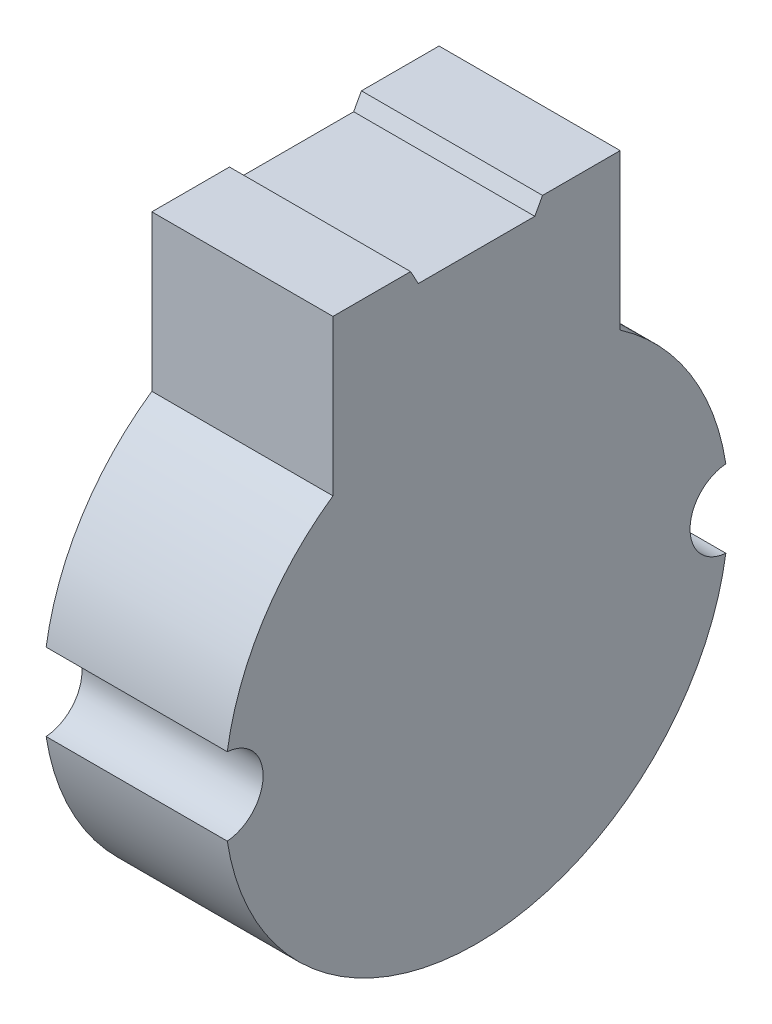
ISO-10303-21;
HEADER;
FILE_DESCRIPTION(('STEP AP214'),'2;1');
FILE_NAME('part.step','',(''),(''),'','','');
FILE_SCHEMA(('AUTOMOTIVE_DESIGN { 1 0 10303 214 1 1 1 1 }'));
ENDSEC;
DATA;
#1=APPLICATION_CONTEXT('core data for automotive mechanical design processes');
#2=APPLICATION_PROTOCOL_DEFINITION('international standard','automotive_design',2000,#1);
#3=PRODUCT_CONTEXT('',#1,'mechanical');
#4=PRODUCT('Part','Part','',(#3));
#5=PRODUCT_RELATED_PRODUCT_CATEGORY('part','',(#4));
#6=PRODUCT_DEFINITION_FORMATION('','',#4);
#7=PRODUCT_DEFINITION_CONTEXT('part definition',#1,'design');
#8=PRODUCT_DEFINITION('design','',#6,#7);
#9=PRODUCT_DEFINITION_SHAPE('','',#8);
#10=(LENGTH_UNIT() NAMED_UNIT(*) SI_UNIT(.MILLI.,.METRE.));
#11=(NAMED_UNIT(*) PLANE_ANGLE_UNIT() SI_UNIT($,.RADIAN.));
#12=(NAMED_UNIT(*) SI_UNIT($,.STERADIAN.) SOLID_ANGLE_UNIT());
#13=UNCERTAINTY_MEASURE_WITH_UNIT(LENGTH_MEASURE(1.E-05),#10,'distance_accuracy_value','');
#14=(GEOMETRIC_REPRESENTATION_CONTEXT(3) GLOBAL_UNCERTAINTY_ASSIGNED_CONTEXT((#13)) GLOBAL_UNIT_ASSIGNED_CONTEXT((#10,
#11,#12)) REPRESENTATION_CONTEXT('',''));
#15=CARTESIAN_POINT('',(0.,0.,0.));
#16=DIRECTION('',(0.,0.,1.));
#17=DIRECTION('',(1.,0.,0.));
#18=AXIS2_PLACEMENT_3D('',#15,#16,#17);
#19=CARTESIAN_POINT('',(14.,-4.27386098873149,-19.5));
#20=DIRECTION('',(-1.,0.,0.));
#21=DIRECTION('',(0.,0.,1.));
#22=AXIS2_PLACEMENT_3D('',#19,#20,#21);
#23=CYLINDRICAL_SURFACE('',#22,3.00000000000001);
#24=CARTESIAN_POINT('',(0.,-4.27386098873149,-19.5));
#25=DIRECTION('',(-1.,0.,0.));
#26=DIRECTION('',(0.,0.,-1.));
#27=AXIS2_PLACEMENT_3D('',#24,#25,#26);
#28=CIRCLE('',#27,3.00000000000001);
#29=CARTESIAN_POINT('',(0.,-7.26497208030436,-19.2692307692307));
#30=VERTEX_POINT('',#29);
#31=CARTESIAN_POINT('',(0.,-1.28274989715862,-19.2692307692308));
#32=VERTEX_POINT('',#31);
#33=EDGE_CURVE('E156',#30,#32,#28,.T.);
#34=ORIENTED_EDGE('',*,*,#33,.T.);
#35=DIRECTION('',(-1.,0.,0.));
#36=VECTOR('',#35,1.);
#37=CARTESIAN_POINT('',(14.,-1.28274989715862,-19.2692307692308));
#38=LINE('',#37,#36);
#39=CARTESIAN_POINT('',(14.,-1.28274989715862,-19.2692307692308));
#40=VERTEX_POINT('',#39);
#41=EDGE_CURVE('E11',#40,#32,#38,.T.);
#42=ORIENTED_EDGE('',*,*,#41,.F.);
#43=CARTESIAN_POINT('',(14.,-4.27386098873149,-19.5));
#44=DIRECTION('',(-1.,0.,0.));
#45=DIRECTION('',(0.,0.,-1.));
#46=AXIS2_PLACEMENT_3D('',#43,#44,#45);
#47=CIRCLE('',#46,3.00000000000001);
#48=CARTESIAN_POINT('',(14.,-7.26497208030436,-19.2692307692307));
#49=VERTEX_POINT('',#48);
#50=EDGE_CURVE('E178',#49,#40,#47,.T.);
#51=ORIENTED_EDGE('',*,*,#50,.F.);
#52=DIRECTION('',(-1.,0.,0.));
#53=VECTOR('',#52,1.);
#54=CARTESIAN_POINT('',(14.,-7.26497208030436,-19.2692307692307));
#55=LINE('',#54,#53);
#56=EDGE_CURVE('E152',#49,#30,#55,.T.);
#57=ORIENTED_EDGE('',*,*,#56,.T.);
#58=EDGE_LOOP('',(#34,#42,#51,#57));
#59=FACE_BOUND('',#58,.T.);
#60=ADVANCED_FACE('F36',(#59),#23,.F.);
#61=CARTESIAN_POINT('',(14.,-4.27386098873135,0.));
#62=DIRECTION('',(-1.,0.,0.));
#63=DIRECTION('',(0.,0.,1.));
#64=AXIS2_PLACEMENT_3D('',#61,#62,#63);
#65=CYLINDRICAL_SURFACE('',#64,19.5);
#66=CARTESIAN_POINT('',(0.,-4.27386098873135,0.));
#67=DIRECTION('',(1.,0.,0.));
#68=DIRECTION('',(0.,0.,-1.));
#69=AXIS2_PLACEMENT_3D('',#66,#67,#68);
#70=CIRCLE('',#69,19.5);
#71=CARTESIAN_POINT('',(0.,11.7586060703335,-11.1));
#72=VERTEX_POINT('',#71);
#73=EDGE_CURVE('E159',#32,#72,#70,.T.);
#74=ORIENTED_EDGE('',*,*,#73,.T.);
#75=DIRECTION('',(-1.,0.,0.));
#76=VECTOR('',#75,1.);
#77=CARTESIAN_POINT('',(14.,11.7586060703335,-11.1));
#78=LINE('',#77,#76);
#79=CARTESIAN_POINT('',(14.,11.7586060703335,-11.1));
#80=VERTEX_POINT('',#79);
#81=EDGE_CURVE('E44',#80,#72,#78,.T.);
#82=ORIENTED_EDGE('',*,*,#81,.F.);
#83=CARTESIAN_POINT('',(14.,-4.27386098873135,0.));
#84=DIRECTION('',(1.,0.,0.));
#85=DIRECTION('',(0.,0.,-1.));
#86=AXIS2_PLACEMENT_3D('',#83,#84,#85);
#87=CIRCLE('',#86,19.5);
#88=EDGE_CURVE('E107',#40,#80,#87,.T.);
#89=ORIENTED_EDGE('',*,*,#88,.F.);
#90=ORIENTED_EDGE('',*,*,#41,.T.);
#91=EDGE_LOOP('',(#74,#82,#89,#90));
#92=FACE_BOUND('',#91,.T.);
#93=ADVANCED_FACE('F256',(#92),#65,.T.);
#94=CARTESIAN_POINT('',(14.,23.7738609887314,-11.1));
#95=DIRECTION('',(0.,0.,1.));
#96=DIRECTION('',(1.,0.,0.));
#97=AXIS2_PLACEMENT_3D('',#94,#95,#96);
#98=PLANE('',#97);
#99=DIRECTION('',(0.,1.,0.));
#100=VECTOR('',#99,1.);
#101=CARTESIAN_POINT('',(0.,23.7738609887314,-11.1));
#102=LINE('',#101,#100);
#103=CARTESIAN_POINT('',(0.,23.7738609887314,-11.1));
#104=VERTEX_POINT('',#103);
#105=EDGE_CURVE('E161',#72,#104,#102,.T.);
#106=ORIENTED_EDGE('',*,*,#105,.T.);
#107=DIRECTION('',(-1.,0.,0.));
#108=VECTOR('',#107,1.);
#109=CARTESIAN_POINT('',(14.,23.7738609887314,-11.1));
#110=LINE('',#109,#108);
#111=CARTESIAN_POINT('',(14.,23.7738609887314,-11.1));
#112=VERTEX_POINT('',#111);
#113=EDGE_CURVE('E197',#112,#104,#110,.T.);
#114=ORIENTED_EDGE('',*,*,#113,.F.);
#115=DIRECTION('',(0.,1.,0.));
#116=VECTOR('',#115,1.);
#117=CARTESIAN_POINT('',(14.,23.7738609887314,-11.1));
#118=LINE('',#117,#116);
#119=EDGE_CURVE('E205',#80,#112,#118,.T.);
#120=ORIENTED_EDGE('',*,*,#119,.F.);
#121=ORIENTED_EDGE('',*,*,#81,.T.);
#122=EDGE_LOOP('',(#106,#114,#120,#121));
#123=FACE_BOUND('',#122,.T.);
#124=ADVANCED_FACE('F203',(#123),#98,.F.);
#125=CARTESIAN_POINT('',(14.,23.7738609887314,-5.09999999999999));
#126=DIRECTION('',(0.,-1.,0.));
#127=DIRECTION('',(0.,0.,-1.));
#128=AXIS2_PLACEMENT_3D('',#125,#126,#127);
#129=PLANE('',#128);
#130=DIRECTION('',(0.,0.,1.));
#131=VECTOR('',#130,1.);
#132=CARTESIAN_POINT('',(0.,23.7738609887314,-5.09999999999999));
#133=LINE('',#132,#131);
#134=CARTESIAN_POINT('',(0.,23.7738609887314,-5.09999999999999));
#135=VERTEX_POINT('',#134);
#136=EDGE_CURVE('E163',#104,#135,#133,.T.);
#137=ORIENTED_EDGE('',*,*,#136,.T.);
#138=DIRECTION('',(-1.,0.,0.));
#139=VECTOR('',#138,1.);
#140=CARTESIAN_POINT('',(14.,23.7738609887314,-5.09999999999999));
#141=LINE('',#140,#139);
#142=CARTESIAN_POINT('',(14.,23.7738609887314,-5.09999999999999));
#143=VERTEX_POINT('',#142);
#144=EDGE_CURVE('E194',#143,#135,#141,.T.);
#145=ORIENTED_EDGE('',*,*,#144,.F.);
#146=DIRECTION('',(0.,0.,1.));
#147=VECTOR('',#146,1.);
#148=CARTESIAN_POINT('',(14.,23.7738609887314,-5.09999999999999));
#149=LINE('',#148,#147);
#150=EDGE_CURVE('E223',#112,#143,#149,.T.);
#151=ORIENTED_EDGE('',*,*,#150,.F.);
#152=ORIENTED_EDGE('',*,*,#113,.T.);
#153=EDGE_LOOP('',(#137,#145,#151,#152));
#154=FACE_BOUND('',#153,.T.);
#155=ADVANCED_FACE('F214',(#154),#129,.F.);
#156=CARTESIAN_POINT('',(14.,22.6738609887314,-4.49999999999999));
#157=DIRECTION('',(0.,-0.478852130680577,-0.877895572914382));
#158=DIRECTION('',(0.,0.877895572914382,-0.478852130680577));
#159=AXIS2_PLACEMENT_3D('',#156,#157,#158);
#160=PLANE('',#159);
#161=DIRECTION('',(0.,-0.877895572914382,0.478852130680577));
#162=VECTOR('',#161,1.);
#163=CARTESIAN_POINT('',(0.,22.6738609887314,-4.49999999999999));
#164=LINE('',#163,#162);
#165=CARTESIAN_POINT('',(0.,22.6738609887314,-4.49999999999999));
#166=VERTEX_POINT('',#165);
#167=EDGE_CURVE('E165',#135,#166,#164,.T.);
#168=ORIENTED_EDGE('',*,*,#167,.T.);
#169=DIRECTION('',(-1.,0.,0.));
#170=VECTOR('',#169,1.);
#171=CARTESIAN_POINT('',(14.,22.6738609887314,-4.49999999999999));
#172=LINE('',#171,#170);
#173=CARTESIAN_POINT('',(14.,22.6738609887314,-4.49999999999999));
#174=VERTEX_POINT('',#173);
#175=EDGE_CURVE('E191',#174,#166,#172,.T.);
#176=ORIENTED_EDGE('',*,*,#175,.F.);
#177=DIRECTION('',(0.,-0.877895572914382,0.478852130680577));
#178=VECTOR('',#177,1.);
#179=CARTESIAN_POINT('',(14.,22.6738609887314,-4.49999999999999));
#180=LINE('',#179,#178);
#181=EDGE_CURVE('E220',#143,#174,#180,.T.);
#182=ORIENTED_EDGE('',*,*,#181,.F.);
#183=ORIENTED_EDGE('',*,*,#144,.T.);
#184=EDGE_LOOP('',(#168,#176,#182,#183));
#185=FACE_BOUND('',#184,.T.);
#186=ADVANCED_FACE('F218',(#185),#160,.F.);
#187=CARTESIAN_POINT('',(14.,22.6738609887314,4.50000000000001));
#188=DIRECTION('',(0.,-1.,0.));
#189=DIRECTION('',(0.,0.,-1.));
#190=AXIS2_PLACEMENT_3D('',#187,#188,#189);
#191=PLANE('',#190);
#192=DIRECTION('',(0.,0.,1.));
#193=VECTOR('',#192,1.);
#194=CARTESIAN_POINT('',(0.,22.6738609887314,4.50000000000001));
#195=LINE('',#194,#193);
#196=CARTESIAN_POINT('',(0.,22.6738609887314,4.50000000000001));
#197=VERTEX_POINT('',#196);
#198=EDGE_CURVE('E167',#166,#197,#195,.T.);
#199=ORIENTED_EDGE('',*,*,#198,.T.);
#200=DIRECTION('',(-1.,0.,0.));
#201=VECTOR('',#200,1.);
#202=CARTESIAN_POINT('',(14.,22.6738609887314,4.50000000000001));
#203=LINE('',#202,#201);
#204=CARTESIAN_POINT('',(14.,22.6738609887314,4.50000000000001));
#205=VERTEX_POINT('',#204);
#206=EDGE_CURVE('E188',#205,#197,#203,.T.);
#207=ORIENTED_EDGE('',*,*,#206,.F.);
#208=DIRECTION('',(0.,0.,1.));
#209=VECTOR('',#208,1.);
#210=CARTESIAN_POINT('',(14.,22.6738609887314,4.50000000000001));
#211=LINE('',#210,#209);
#212=EDGE_CURVE('E222',#174,#205,#211,.T.);
#213=ORIENTED_EDGE('',*,*,#212,.F.);
#214=ORIENTED_EDGE('',*,*,#175,.T.);
#215=EDGE_LOOP('',(#199,#207,#213,#214));
#216=FACE_BOUND('',#215,.T.);
#217=ADVANCED_FACE('F269',(#216),#191,.F.);
#218=CARTESIAN_POINT('',(14.,22.6738609887314,4.50000000000001));
#219=DIRECTION('',(0.,-0.478852130680577,0.877895572914382));
#220=DIRECTION('',(0.,-0.877895572914382,-0.478852130680577));
#221=AXIS2_PLACEMENT_3D('',#218,#219,#220);
#222=PLANE('',#221);
#223=DIRECTION('',(0.,0.877895572914382,0.478852130680577));
#224=VECTOR('',#223,1.);
#225=CARTESIAN_POINT('',(0.,22.6738609887314,4.50000000000001));
#226=LINE('',#225,#224);
#227=CARTESIAN_POINT('',(0.,23.7738609887314,5.10000000000001));
#228=VERTEX_POINT('',#227);
#229=EDGE_CURVE('E169',#197,#228,#226,.T.);
#230=ORIENTED_EDGE('',*,*,#229,.T.);
#231=DIRECTION('',(-1.,0.,0.));
#232=VECTOR('',#231,1.);
#233=CARTESIAN_POINT('',(14.,23.7738609887314,5.10000000000001));
#234=LINE('',#233,#232);
#235=CARTESIAN_POINT('',(14.,23.7738609887314,5.10000000000001));
#236=VERTEX_POINT('',#235);
#237=EDGE_CURVE('E185',#236,#228,#234,.T.);
#238=ORIENTED_EDGE('',*,*,#237,.F.);
#239=DIRECTION('',(0.,0.877895572914382,0.478852130680577));
#240=VECTOR('',#239,1.);
#241=CARTESIAN_POINT('',(14.,22.6738609887314,4.50000000000001));
#242=LINE('',#241,#240);
#243=EDGE_CURVE('E225',#205,#236,#242,.T.);
#244=ORIENTED_EDGE('',*,*,#243,.F.);
#245=ORIENTED_EDGE('',*,*,#206,.T.);
#246=EDGE_LOOP('',(#230,#238,#244,#245));
#247=FACE_BOUND('',#246,.T.);
#248=ADVANCED_FACE('F272',(#247),#222,.F.);
#249=CARTESIAN_POINT('',(14.,23.7738609887314,11.1));
#250=DIRECTION('',(0.,-1.,0.));
#251=DIRECTION('',(0.,0.,-1.));
#252=AXIS2_PLACEMENT_3D('',#249,#250,#251);
#253=PLANE('',#252);
#254=DIRECTION('',(0.,0.,1.));
#255=VECTOR('',#254,1.);
#256=CARTESIAN_POINT('',(0.,23.7738609887314,11.1));
#257=LINE('',#256,#255);
#258=CARTESIAN_POINT('',(0.,23.7738609887314,11.1));
#259=VERTEX_POINT('',#258);
#260=EDGE_CURVE('E171',#228,#259,#257,.T.);
#261=ORIENTED_EDGE('',*,*,#260,.T.);
#262=DIRECTION('',(-1.,0.,0.));
#263=VECTOR('',#262,1.);
#264=CARTESIAN_POINT('',(14.,23.7738609887314,11.1));
#265=LINE('',#264,#263);
#266=CARTESIAN_POINT('',(14.,23.7738609887314,11.1));
#267=VERTEX_POINT('',#266);
#268=EDGE_CURVE('E182',#267,#259,#265,.T.);
#269=ORIENTED_EDGE('',*,*,#268,.F.);
#270=DIRECTION('',(0.,0.,1.));
#271=VECTOR('',#270,1.);
#272=CARTESIAN_POINT('',(14.,23.7738609887314,11.1));
#273=LINE('',#272,#271);
#274=EDGE_CURVE('E231',#236,#267,#273,.T.);
#275=ORIENTED_EDGE('',*,*,#274,.F.);
#276=ORIENTED_EDGE('',*,*,#237,.T.);
#277=EDGE_LOOP('',(#261,#269,#275,#276));
#278=FACE_BOUND('',#277,.T.);
#279=ADVANCED_FACE('F237',(#278),#253,.F.);
#280=CARTESIAN_POINT('',(14.,11.7586060703335,11.1));
#281=DIRECTION('',(0.,0.,-1.));
#282=DIRECTION('',(-1.,0.,0.));
#283=AXIS2_PLACEMENT_3D('',#280,#281,#282);
#284=PLANE('',#283);
#285=DIRECTION('',(0.,-1.,0.));
#286=VECTOR('',#285,1.);
#287=CARTESIAN_POINT('',(0.,11.7586060703335,11.1));
#288=LINE('',#287,#286);
#289=CARTESIAN_POINT('',(0.,11.7586060703335,11.1));
#290=VERTEX_POINT('',#289);
#291=EDGE_CURVE('E173',#259,#290,#288,.T.);
#292=ORIENTED_EDGE('',*,*,#291,.T.);
#293=DIRECTION('',(-1.,0.,0.));
#294=VECTOR('',#293,1.);
#295=CARTESIAN_POINT('',(14.,11.7586060703335,11.1));
#296=LINE('',#295,#294);
#297=CARTESIAN_POINT('',(14.,11.7586060703335,11.1));
#298=VERTEX_POINT('',#297);
#299=EDGE_CURVE('E147',#298,#290,#296,.T.);
#300=ORIENTED_EDGE('',*,*,#299,.F.);
#301=DIRECTION('',(0.,-1.,0.));
#302=VECTOR('',#301,1.);
#303=CARTESIAN_POINT('',(14.,11.7586060703335,11.1));
#304=LINE('',#303,#302);
#305=EDGE_CURVE('E138',#267,#298,#304,.T.);
#306=ORIENTED_EDGE('',*,*,#305,.F.);
#307=ORIENTED_EDGE('',*,*,#268,.T.);
#308=EDGE_LOOP('',(#292,#300,#306,#307));
#309=FACE_BOUND('',#308,.T.);
#310=ADVANCED_FACE('F241',(#309),#284,.F.);
#311=CARTESIAN_POINT('',(14.,-4.27386098873135,0.));
#312=DIRECTION('',(-1.,0.,0.));
#313=DIRECTION('',(0.,0.,1.));
#314=AXIS2_PLACEMENT_3D('',#311,#312,#313);
#315=CYLINDRICAL_SURFACE('',#314,19.5);
#316=CARTESIAN_POINT('',(0.,-4.27386098873135,0.));
#317=DIRECTION('',(1.,0.,0.));
#318=DIRECTION('',(0.,0.,-1.));
#319=AXIS2_PLACEMENT_3D('',#316,#317,#318);
#320=CIRCLE('',#319,19.5);
#321=CARTESIAN_POINT('',(0.,-1.28274989715849,19.2692307692308));
#322=VERTEX_POINT('',#321);
#323=EDGE_CURVE('E146',#290,#322,#320,.T.);
#324=ORIENTED_EDGE('',*,*,#323,.T.);
#325=DIRECTION('',(-1.,0.,0.));
#326=VECTOR('',#325,1.);
#327=CARTESIAN_POINT('',(14.,-1.28274989715849,19.2692307692308));
#328=LINE('',#327,#326);
#329=CARTESIAN_POINT('',(14.,-1.28274989715849,19.2692307692308));
#330=VERTEX_POINT('',#329);
#331=EDGE_CURVE('E143',#330,#322,#328,.T.);
#332=ORIENTED_EDGE('',*,*,#331,.F.);
#333=CARTESIAN_POINT('',(14.,-4.27386098873135,0.));
#334=DIRECTION('',(1.,0.,0.));
#335=DIRECTION('',(0.,0.,-1.));
#336=AXIS2_PLACEMENT_3D('',#333,#334,#335);
#337=CIRCLE('',#336,19.5);
#338=EDGE_CURVE('E132',#298,#330,#337,.T.);
#339=ORIENTED_EDGE('',*,*,#338,.F.);
#340=ORIENTED_EDGE('',*,*,#299,.T.);
#341=EDGE_LOOP('',(#324,#332,#339,#340));
#342=FACE_BOUND('',#341,.T.);
#343=ADVANCED_FACE('F144',(#342),#315,.T.);
#344=CARTESIAN_POINT('',(14.,-4.27386098873135,19.5));
#345=DIRECTION('',(-1.,0.,0.));
#346=DIRECTION('',(0.,0.,1.));
#347=AXIS2_PLACEMENT_3D('',#344,#345,#346);
#348=CYLINDRICAL_SURFACE('',#347,3.00000000000001);
#349=CARTESIAN_POINT('',(0.,-4.27386098873135,19.5));
#350=DIRECTION('',(-1.,0.,0.));
#351=DIRECTION('',(0.,0.,-1.));
#352=AXIS2_PLACEMENT_3D('',#349,#350,#351);
#353=CIRCLE('',#352,3.00000000000001);
#354=CARTESIAN_POINT('',(0.,-7.26497208030422,19.2692307692308));
#355=VERTEX_POINT('',#354);
#356=EDGE_CURVE('E93',#322,#355,#353,.T.);
#357=ORIENTED_EDGE('',*,*,#356,.T.);
#358=DIRECTION('',(-1.,0.,0.));
#359=VECTOR('',#358,1.);
#360=CARTESIAN_POINT('',(14.,-7.26497208030422,19.2692307692308));
#361=LINE('',#360,#359);
#362=CARTESIAN_POINT('',(14.,-7.26497208030422,19.2692307692308));
#363=VERTEX_POINT('',#362);
#364=EDGE_CURVE('E148',#363,#355,#361,.T.);
#365=ORIENTED_EDGE('',*,*,#364,.F.);
#366=CARTESIAN_POINT('',(14.,-4.27386098873135,19.5));
#367=DIRECTION('',(-1.,0.,0.));
#368=DIRECTION('',(0.,0.,-1.));
#369=AXIS2_PLACEMENT_3D('',#366,#367,#368);
#370=CIRCLE('',#369,3.00000000000001);
#371=EDGE_CURVE('E136',#330,#363,#370,.T.);
#372=ORIENTED_EDGE('',*,*,#371,.F.);
#373=ORIENTED_EDGE('',*,*,#331,.T.);
#374=EDGE_LOOP('',(#357,#365,#372,#373));
#375=FACE_BOUND('',#374,.T.);
#376=ADVANCED_FACE('F150',(#375),#348,.F.);
#377=CARTESIAN_POINT('',(14.,-4.27386098873135,0.));
#378=DIRECTION('',(-1.,0.,0.));
#379=DIRECTION('',(0.,0.,1.));
#380=AXIS2_PLACEMENT_3D('',#377,#378,#379);
#381=CYLINDRICAL_SURFACE('',#380,19.5);
#382=CARTESIAN_POINT('',(0.,-4.27386098873135,0.));
#383=DIRECTION('',(1.,0.,0.));
#384=DIRECTION('',(0.,0.,-1.));
#385=AXIS2_PLACEMENT_3D('',#382,#383,#384);
#386=CIRCLE('',#385,19.5);
#387=EDGE_CURVE('E99',#355,#30,#386,.T.);
#388=ORIENTED_EDGE('',*,*,#387,.T.);
#389=ORIENTED_EDGE('',*,*,#56,.F.);
#390=CARTESIAN_POINT('',(14.,-4.27386098873135,0.));
#391=DIRECTION('',(1.,0.,0.));
#392=DIRECTION('',(0.,0.,-1.));
#393=AXIS2_PLACEMENT_3D('',#390,#391,#392);
#394=CIRCLE('',#393,19.5);
#395=EDGE_CURVE('E52',#363,#49,#394,.T.);
#396=ORIENTED_EDGE('',*,*,#395,.F.);
#397=ORIENTED_EDGE('',*,*,#364,.T.);
#398=EDGE_LOOP('',(#388,#389,#396,#397));
#399=FACE_BOUND('',#398,.T.);
#400=ADVANCED_FACE('F245',(#399),#381,.T.);
#401=CARTESIAN_POINT('',(14.,-4.27386098873149,-19.5));
#402=DIRECTION('',(1.,0.,0.));
#403=DIRECTION('',(0.,0.,-1.));
#404=AXIS2_PLACEMENT_3D('',#401,#402,#403);
#405=PLANE('',#404);
#406=ORIENTED_EDGE('',*,*,#50,.T.);
#407=ORIENTED_EDGE('',*,*,#88,.T.);
#408=ORIENTED_EDGE('',*,*,#119,.T.);
#409=ORIENTED_EDGE('',*,*,#150,.T.);
#410=ORIENTED_EDGE('',*,*,#181,.T.);
#411=ORIENTED_EDGE('',*,*,#212,.T.);
#412=ORIENTED_EDGE('',*,*,#243,.T.);
#413=ORIENTED_EDGE('',*,*,#274,.T.);
#414=ORIENTED_EDGE('',*,*,#305,.T.);
#415=ORIENTED_EDGE('',*,*,#338,.T.);
#416=ORIENTED_EDGE('',*,*,#371,.T.);
#417=ORIENTED_EDGE('',*,*,#395,.T.);
#418=EDGE_LOOP('',(#406,#407,#408,#409,#410,#411,#412,#413,#414,#415,#416,#417));
#419=FACE_BOUND('',#418,.T.);
#420=ADVANCED_FACE('F134',(#419),#405,.T.);
#421=CARTESIAN_POINT('',(0.,-4.27386098873149,-19.5));
#422=DIRECTION('',(1.,0.,0.));
#423=DIRECTION('',(0.,0.,-1.));
#424=AXIS2_PLACEMENT_3D('',#421,#422,#423);
#425=PLANE('',#424);
#426=ORIENTED_EDGE('',*,*,#33,.F.);
#427=ORIENTED_EDGE('',*,*,#387,.F.);
#428=ORIENTED_EDGE('',*,*,#356,.F.);
#429=ORIENTED_EDGE('',*,*,#323,.F.);
#430=ORIENTED_EDGE('',*,*,#291,.F.);
#431=ORIENTED_EDGE('',*,*,#260,.F.);
#432=ORIENTED_EDGE('',*,*,#229,.F.);
#433=ORIENTED_EDGE('',*,*,#198,.F.);
#434=ORIENTED_EDGE('',*,*,#167,.F.);
#435=ORIENTED_EDGE('',*,*,#136,.F.);
#436=ORIENTED_EDGE('',*,*,#105,.F.);
#437=ORIENTED_EDGE('',*,*,#73,.F.);
#438=EDGE_LOOP('',(#426,#427,#428,#429,#430,#431,#432,#433,#434,#435,#436,#437));
#439=FACE_BOUND('',#438,.T.);
#440=ADVANCED_FACE('F209',(#439),#425,.F.);
#441=CLOSED_SHELL('',(#60,#93,#124,#155,#186,#217,#248,#279,#310,#343,#376,#400,#420,#440));
#442=MANIFOLD_SOLID_BREP('B2',#441);
#443=ADVANCED_BREP_SHAPE_REPRESENTATION('',(#18,#442),#14);
#444=SHAPE_DEFINITION_REPRESENTATION(#9,#443);
ENDSEC;
END-ISO-10303-21;
